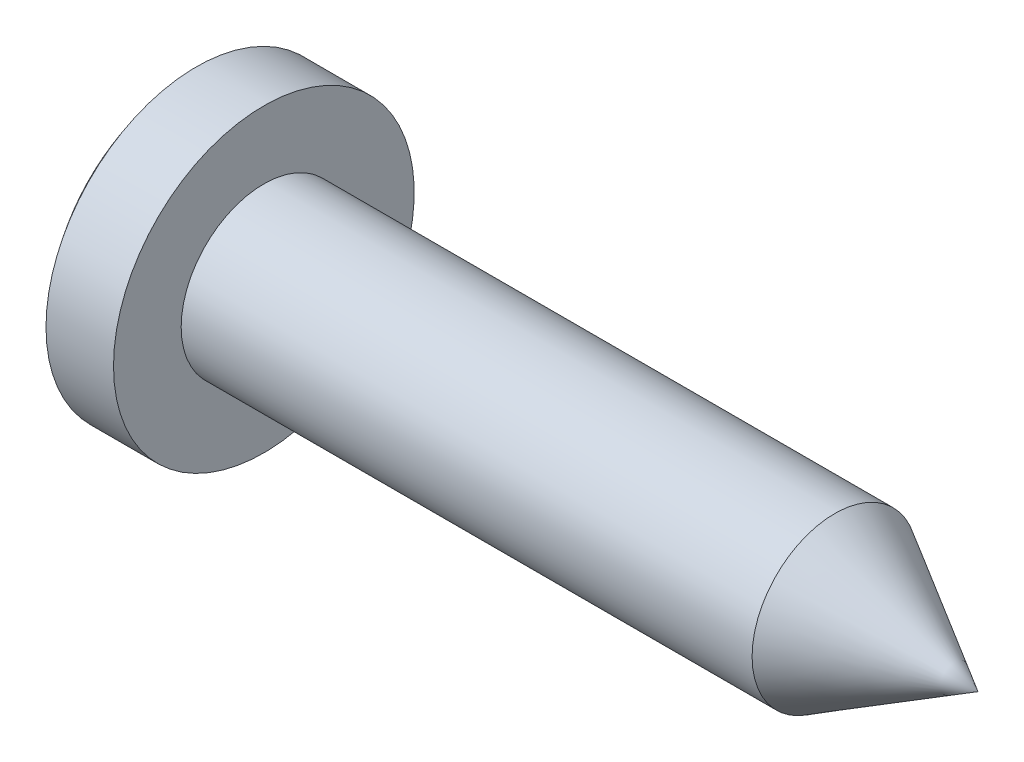
ISO-10303-21;
HEADER;
FILE_DESCRIPTION(('STEP AP214'),'2;1');
FILE_NAME('part.step','',(''),(''),'','','');
FILE_SCHEMA(('AUTOMOTIVE_DESIGN { 1 0 10303 214 1 1 1 1 }'));
ENDSEC;
DATA;
#1=APPLICATION_CONTEXT('core data for automotive mechanical design processes');
#2=APPLICATION_PROTOCOL_DEFINITION('international standard','automotive_design',2000,#1);
#3=PRODUCT_CONTEXT('',#1,'mechanical');
#4=PRODUCT('Part','Part','',(#3));
#5=PRODUCT_RELATED_PRODUCT_CATEGORY('part','',(#4));
#6=PRODUCT_DEFINITION_FORMATION('','',#4);
#7=PRODUCT_DEFINITION_CONTEXT('part definition',#1,'design');
#8=PRODUCT_DEFINITION('design','',#6,#7);
#9=PRODUCT_DEFINITION_SHAPE('','',#8);
#10=(LENGTH_UNIT() NAMED_UNIT(*) SI_UNIT(.MILLI.,.METRE.));
#11=(NAMED_UNIT(*) PLANE_ANGLE_UNIT() SI_UNIT($,.RADIAN.));
#12=(NAMED_UNIT(*) SI_UNIT($,.STERADIAN.) SOLID_ANGLE_UNIT());
#13=UNCERTAINTY_MEASURE_WITH_UNIT(LENGTH_MEASURE(1.E-05),#10,'distance_accuracy_value','');
#14=(GEOMETRIC_REPRESENTATION_CONTEXT(3) GLOBAL_UNCERTAINTY_ASSIGNED_CONTEXT((#13)) GLOBAL_UNIT_ASSIGNED_CONTEXT((#10,
#11,#12)) REPRESENTATION_CONTEXT('',''));
#15=CARTESIAN_POINT('',(0.,0.,0.));
#16=DIRECTION('',(0.,0.,1.));
#17=DIRECTION('',(1.,0.,0.));
#18=AXIS2_PLACEMENT_3D('',#15,#16,#17);
#19=CARTESIAN_POINT('',(1.6,0.,0.));
#20=DIRECTION('',(-1.,0.,0.));
#21=DIRECTION('',(0.,1.,0.));
#22=AXIS2_PLACEMENT_3D('',#19,#20,#21);
#23=SPHERICAL_SURFACE('',#22,3.2);
#24=CARTESIAN_POINT('',(-0.89799919935936,0.,0.));
#25=DIRECTION('',(-1.,0.,0.));
#26=DIRECTION('',(0.,0.,1.));
#27=AXIS2_PLACEMENT_3D('',#24,#25,#26);
#28=CIRCLE('',#27,2.);
#29=CARTESIAN_POINT('',(-0.89799919935936,0.,2.));
#30=VERTEX_POINT('',#29);
#31=EDGE_CURVE('E288',#30,#30,#28,.T.);
#32=ORIENTED_EDGE('',*,*,#31,.T.);
#33=EDGE_LOOP('',(#32));
#34=FACE_BOUND('',#33,.T.);
#35=CARTESIAN_POINT('',(1.56503616117409,0.0806815870157537,0.322726348063015));
#36=DIRECTION('',(0.104528463267654,-0.241206989505462,-0.964827958021851));
#37=DIRECTION('',(0.,0.970142500145332,-0.242535625036333));
#38=AXIS2_PLACEMENT_3D('',#35,#36,#37);
#39=CIRCLE('',#38,3.18247006517848);
#40=CARTESIAN_POINT('',(-1.45274996309991,0.934523397478773,-0.217677932639515));
#41=VERTEX_POINT('',#40);
#42=CARTESIAN_POINT('',(-1.54602165644221,0.569150220513997,-0.136439597205102));
#43=VERTEX_POINT('',#42);
#44=EDGE_CURVE('E11',#41,#43,#39,.F.);
#45=ORIENTED_EDGE('',*,*,#44,.F.);
#46=CARTESIAN_POINT('',(1.66379421431252,0.606961405040141,0.));
#47=DIRECTION('',(0.104528463267654,0.994521895368273,0.));
#48=DIRECTION('',(-0.994521895368273,0.104528463267654,0.));
#49=AXIS2_PLACEMENT_3D('',#46,#47,#48);
#50=CIRCLE('',#49,3.14126219074625);
#51=CARTESIAN_POINT('',(-1.45274996309991,0.934523397478773,0.217677932639514));
#52=VERTEX_POINT('',#51);
#53=EDGE_CURVE('E43',#52,#41,#50,.F.);
#54=ORIENTED_EDGE('',*,*,#53,.F.);
#55=CARTESIAN_POINT('',(1.56503616117409,0.0806815870157537,-0.322726348063015));
#56=DIRECTION('',(0.104528463267654,-0.241206989505462,0.964827958021851));
#57=DIRECTION('',(0.,-0.970142500145332,-0.242535625036333));
#58=AXIS2_PLACEMENT_3D('',#55,#56,#57);
#59=CIRCLE('',#58,3.18247006517848);
#60=CARTESIAN_POINT('',(-1.54602165644221,0.569150220513997,0.136439597205102));
#61=VERTEX_POINT('',#60);
#62=EDGE_CURVE('E328',#61,#52,#59,.F.);
#63=ORIENTED_EDGE('',*,*,#62,.F.);
#64=CARTESIAN_POINT('',(1.60749262454255,0.0356437803082173,0.0617368384676569));
#65=DIRECTION('',(0.104528463267654,0.497260947684128,0.861281226008779));
#66=DIRECTION('',(0.,-0.866025403784443,0.499999999999992));
#67=AXIS2_PLACEMENT_3D('',#64,#65,#66);
#68=CIRCLE('',#67,3.19919707806175);
#69=CARTESIAN_POINT('',(-1.57234339721419,0.296847915734236,0.296847915734238));
#70=VERTEX_POINT('',#69);
#71=EDGE_CURVE('E326',#70,#61,#68,.F.);
#72=ORIENTED_EDGE('',*,*,#71,.F.);
#73=CARTESIAN_POINT('',(1.60749262454255,0.0617368384676551,0.0356437803082149));
#74=DIRECTION('',(0.104528463267654,0.861281226008788,0.497260947684114));
#75=DIRECTION('',(0.,-0.499999999999977,0.866025403784452));
#76=AXIS2_PLACEMENT_3D('',#73,#74,#75);
#77=CIRCLE('',#76,3.19919707806175);
#78=CARTESIAN_POINT('',(-1.54602165644221,0.136439597205108,0.569150220513995));
#79=VERTEX_POINT('',#78);
#80=EDGE_CURVE('E324',#79,#70,#77,.F.);
#81=ORIENTED_EDGE('',*,*,#80,.F.);
#82=CARTESIAN_POINT('',(1.56503616117409,-0.322726348063014,0.0806815870157571));
#83=DIRECTION('',(0.104528463267654,0.964827958021848,-0.241206989505473));
#84=DIRECTION('',(0.,0.242535625036343,0.970142500145329));
#85=AXIS2_PLACEMENT_3D('',#82,#83,#84);
#86=CIRCLE('',#85,3.18247006517848);
#87=CARTESIAN_POINT('',(-1.45274996309991,0.217677932639524,0.934523397478771));
#88=VERTEX_POINT('',#87);
#89=EDGE_CURVE('E322',#88,#79,#86,.F.);
#90=ORIENTED_EDGE('',*,*,#89,.F.);
#91=CARTESIAN_POINT('',(1.66379421431252,0.,0.606961405040141));
#92=DIRECTION('',(0.104528463267654,0.,0.994521895368273));
#93=DIRECTION('',(0.994521895368273,0.,-0.104528463267654));
#94=AXIS2_PLACEMENT_3D('',#91,#92,#93);
#95=CIRCLE('',#94,3.14126219074625);
#96=CARTESIAN_POINT('',(-1.45274996309991,-0.217677932639505,0.934523397478775));
#97=VERTEX_POINT('',#96);
#98=EDGE_CURVE('E320',#97,#88,#95,.F.);
#99=ORIENTED_EDGE('',*,*,#98,.F.);
#100=CARTESIAN_POINT('',(1.56503616117409,0.322726348063016,0.0806815870157503));
#101=DIRECTION('',(0.104528463267654,-0.964827958021853,-0.241206989505452));
#102=DIRECTION('',(0.,0.242535625036323,-0.970142500145334));
#103=AXIS2_PLACEMENT_3D('',#100,#101,#102);
#104=CIRCLE('',#103,3.18247006517848);
#105=CARTESIAN_POINT('',(-1.54602165644221,-0.136439597205096,0.569150220513998));
#106=VERTEX_POINT('',#105);
#107=EDGE_CURVE('E318',#106,#97,#104,.F.);
#108=ORIENTED_EDGE('',*,*,#107,.F.);
#109=CARTESIAN_POINT('',(1.60749262454255,-0.0617368384676559,0.0356437803082175));
#110=DIRECTION('',(0.104528463267654,-0.861281226008775,0.497260947684136));
#111=DIRECTION('',(0.,-0.499999999999999,-0.866025403784439));
#112=AXIS2_PLACEMENT_3D('',#109,#110,#111);
#113=CIRCLE('',#112,3.19919707806175);
#114=CARTESIAN_POINT('',(-1.57234339721419,-0.296847915734233,0.296847915734241));
#115=VERTEX_POINT('',#114);
#116=EDGE_CURVE('E316',#115,#106,#113,.F.);
#117=ORIENTED_EDGE('',*,*,#116,.F.);
#118=CARTESIAN_POINT('',(1.60749262454255,-0.035643780308217,0.0617368384676573));
#119=DIRECTION('',(0.104528463267654,-0.497260947684123,0.861281226008782));
#120=DIRECTION('',(0.,-0.866025403784447,-0.499999999999986));
#121=AXIS2_PLACEMENT_3D('',#118,#119,#120);
#122=CIRCLE('',#121,3.19919707806175);
#123=CARTESIAN_POINT('',(-1.54602165644221,-0.569150220513996,0.136439597205106));
#124=VERTEX_POINT('',#123);
#125=EDGE_CURVE('E314',#124,#115,#122,.F.);
#126=ORIENTED_EDGE('',*,*,#125,.F.);
#127=CARTESIAN_POINT('',(1.56503616117409,-0.0806815870157559,-0.322726348063015));
#128=DIRECTION('',(0.104528463267654,0.241206989505469,0.964827958021849));
#129=DIRECTION('',(0.,-0.97014250014533,0.242535625036339));
#130=AXIS2_PLACEMENT_3D('',#127,#128,#129);
#131=CIRCLE('',#130,3.18247006517848);
#132=CARTESIAN_POINT('',(-1.45274996309991,-0.934523397478772,0.217677932639521));
#133=VERTEX_POINT('',#132);
#134=EDGE_CURVE('E312',#133,#124,#131,.F.);
#135=ORIENTED_EDGE('',*,*,#134,.F.);
#136=CARTESIAN_POINT('',(1.66379421431252,-0.606961405040141,0.));
#137=DIRECTION('',(0.104528463267654,-0.994521895368273,0.));
#138=DIRECTION('',(0.994521895368273,0.104528463267654,0.));
#139=AXIS2_PLACEMENT_3D('',#136,#137,#138);
#140=CIRCLE('',#139,3.14126219074625);
#141=CARTESIAN_POINT('',(-1.45274996309991,-0.934523397478775,-0.217677932639508));
#142=VERTEX_POINT('',#141);
#143=EDGE_CURVE('E310',#142,#133,#140,.F.);
#144=ORIENTED_EDGE('',*,*,#143,.F.);
#145=CARTESIAN_POINT('',(1.56503616117409,-0.0806815870157514,0.322726348063016));
#146=DIRECTION('',(0.104528463267654,0.241206989505456,-0.964827958021853));
#147=DIRECTION('',(0.,0.970142500145334,0.242535625036326));
#148=AXIS2_PLACEMENT_3D('',#145,#146,#147);
#149=CIRCLE('',#148,3.18247006517848);
#150=CARTESIAN_POINT('',(-1.54602165644221,-0.569150220513998,-0.136439597205098));
#151=VERTEX_POINT('',#150);
#152=EDGE_CURVE('E308',#151,#142,#149,.F.);
#153=ORIENTED_EDGE('',*,*,#152,.F.);
#154=CARTESIAN_POINT('',(1.60749262454255,-0.035643780308221,-0.0617368384676605));
#155=DIRECTION('',(0.104528463267654,-0.497260947684145,-0.861281226008769));
#156=DIRECTION('',(0.,0.866025403784434,-0.500000000000008));
#157=AXIS2_PLACEMENT_3D('',#154,#155,#156);
#158=CIRCLE('',#157,3.19919707806175);
#159=CARTESIAN_POINT('',(-1.57234339721419,-0.296847915734241,-0.296847915734238));
#160=VERTEX_POINT('',#159);
#161=EDGE_CURVE('E306',#160,#151,#158,.F.);
#162=ORIENTED_EDGE('',*,*,#161,.F.);
#163=CARTESIAN_POINT('',(1.60749262454255,-0.0617368384676609,-0.0356437803082204));
#164=DIRECTION('',(0.104528463267654,-0.861281226008775,-0.497260947684136));
#165=DIRECTION('',(0.,0.499999999999999,-0.866025403784439));
#166=AXIS2_PLACEMENT_3D('',#163,#164,#165);
#167=CIRCLE('',#166,3.19919707806175);
#168=CARTESIAN_POINT('',(-1.54602165644221,-0.136439597205104,-0.569150220513996));
#169=VERTEX_POINT('',#168);
#170=EDGE_CURVE('E304',#169,#160,#167,.F.);
#171=ORIENTED_EDGE('',*,*,#170,.F.);
#172=CARTESIAN_POINT('',(1.56503616117409,0.322726348063015,-0.0806815870157548));
#173=DIRECTION('',(0.104528463267654,-0.96482795802185,0.241206989505466));
#174=DIRECTION('',(0.,-0.242535625036336,-0.970142500145331));
#175=AXIS2_PLACEMENT_3D('',#172,#173,#174);
#176=CIRCLE('',#175,3.18247006517848);
#177=CARTESIAN_POINT('',(-1.45274996309991,-0.217677932639518,-0.934523397478772));
#178=VERTEX_POINT('',#177);
#179=EDGE_CURVE('E302',#178,#169,#176,.F.);
#180=ORIENTED_EDGE('',*,*,#179,.F.);
#181=CARTESIAN_POINT('',(1.66379421431252,0.,-0.606961405040141));
#182=DIRECTION('',(0.104528463267654,0.,-0.994521895368273));
#183=DIRECTION('',(-0.994521895368273,0.,-0.104528463267654));
#184=AXIS2_PLACEMENT_3D('',#181,#182,#183);
#185=CIRCLE('',#184,3.14126219074625);
#186=CARTESIAN_POINT('',(-1.45274996309991,0.217677932639511,-0.934523397478774));
#187=VERTEX_POINT('',#186);
#188=EDGE_CURVE('E300',#187,#178,#185,.F.);
#189=ORIENTED_EDGE('',*,*,#188,.F.);
#190=CARTESIAN_POINT('',(1.56503616117409,-0.322726348063015,-0.0806815870157525));
#191=DIRECTION('',(0.104528463267654,0.964827958021852,0.241206989505459));
#192=DIRECTION('',(0.,-0.242535625036329,0.970142500145333));
#193=AXIS2_PLACEMENT_3D('',#190,#191,#192);
#194=CIRCLE('',#193,3.18247006517848);
#195=CARTESIAN_POINT('',(-1.54602165644221,0.1364395972051,-0.569150220513997));
#196=VERTEX_POINT('',#195);
#197=EDGE_CURVE('E298',#196,#187,#194,.F.);
#198=ORIENTED_EDGE('',*,*,#197,.F.);
#199=CARTESIAN_POINT('',(1.60749262454255,0.0617368384676561,-0.035643780308217));
#200=DIRECTION('',(0.104528463267654,0.861281226008778,-0.497260947684129));
#201=DIRECTION('',(0.,0.499999999999993,0.866025403784443));
#202=AXIS2_PLACEMENT_3D('',#199,#200,#201);
#203=CIRCLE('',#202,3.19919707806175);
#204=CARTESIAN_POINT('',(-1.57234339721419,0.296847915734236,-0.296847915734239));
#205=VERTEX_POINT('',#204);
#206=EDGE_CURVE('E296',#205,#196,#203,.F.);
#207=ORIENTED_EDGE('',*,*,#206,.F.);
#208=CARTESIAN_POINT('',(1.60749262454255,0.0356437803082174,-0.061736838467657));
#209=DIRECTION('',(0.104528463267654,0.497260947684129,-0.861281226008779));
#210=DIRECTION('',(0.,0.866025403784443,0.499999999999992));
#211=AXIS2_PLACEMENT_3D('',#208,#209,#210);
#212=CIRCLE('',#211,3.19919707806175);
#213=EDGE_CURVE('E294',#43,#205,#212,.F.);
#214=ORIENTED_EDGE('',*,*,#213,.F.);
#215=EDGE_LOOP('',(#45,#54,#63,#72,#81,#90,#99,#108,#117,#126,#135,#144,#153,#162,#171,#180,
#189,#198,#207,#214));
#216=FACE_BOUND('',#215,.T.);
#217=ADVANCED_FACE('F35',(#34,#216),#23,.T.);
#218=CARTESIAN_POINT('',(0.,0.,0.));
#219=DIRECTION('',(-1.,0.,0.));
#220=DIRECTION('',(0.,0.,1.));
#221=AXIS2_PLACEMENT_3D('',#218,#219,#220);
#222=CYLINDRICAL_SURFACE('',#221,1.1);
#223=CARTESIAN_POINT('',(0.,0.,0.));
#224=DIRECTION('',(-1.,0.,0.));
#225=DIRECTION('',(0.,0.,1.));
#226=AXIS2_PLACEMENT_3D('',#223,#224,#225);
#227=CIRCLE('',#226,1.1);
#228=CARTESIAN_POINT('',(0.,0.,1.1));
#229=VERTEX_POINT('',#228);
#230=EDGE_CURVE('E195',#229,#229,#227,.T.);
#231=ORIENTED_EDGE('',*,*,#230,.F.);
#232=EDGE_LOOP('',(#231));
#233=FACE_BOUND('',#232,.T.);
#234=CARTESIAN_POINT('',(7.59474411167421,0.,0.));
#235=DIRECTION('',(-1.,0.,0.));
#236=DIRECTION('',(0.,0.,1.));
#237=AXIS2_PLACEMENT_3D('',#234,#235,#236);
#238=CIRCLE('',#237,1.1);
#239=CARTESIAN_POINT('',(7.59474411167421,0.,1.1));
#240=VERTEX_POINT('',#239);
#241=EDGE_CURVE('E191',#240,#240,#238,.T.);
#242=ORIENTED_EDGE('',*,*,#241,.T.);
#243=EDGE_LOOP('',(#242));
#244=FACE_BOUND('',#243,.T.);
#245=ADVANCED_FACE('F424',(#233,#244),#222,.T.);
#246=CARTESIAN_POINT('',(0.,1.1,0.));
#247=DIRECTION('',(-1.,0.,0.));
#248=DIRECTION('',(0.,0.,1.));
#249=AXIS2_PLACEMENT_3D('',#246,#247,#248);
#250=PLANE('',#249);
#251=CARTESIAN_POINT('',(0.,0.,0.));
#252=DIRECTION('',(-1.,0.,0.));
#253=DIRECTION('',(0.,0.,1.));
#254=AXIS2_PLACEMENT_3D('',#251,#252,#253);
#255=CIRCLE('',#254,2.);
#256=CARTESIAN_POINT('',(0.,0.,2.));
#257=VERTEX_POINT('',#256);
#258=EDGE_CURVE('E291',#257,#257,#255,.T.);
#259=ORIENTED_EDGE('',*,*,#258,.F.);
#260=EDGE_LOOP('',(#259));
#261=FACE_BOUND('',#260,.T.);
#262=ORIENTED_EDGE('',*,*,#230,.T.);
#263=EDGE_LOOP('',(#262));
#264=FACE_BOUND('',#263,.T.);
#265=ADVANCED_FACE('F37',(#261,#264),#250,.F.);
#266=CARTESIAN_POINT('',(0.,0.,0.));
#267=DIRECTION('',(-1.,0.,0.));
#268=DIRECTION('',(0.,0.,1.));
#269=AXIS2_PLACEMENT_3D('',#266,#267,#268);
#270=CYLINDRICAL_SURFACE('',#269,2.);
#271=ORIENTED_EDGE('',*,*,#31,.F.);
#272=EDGE_LOOP('',(#271));
#273=FACE_BOUND('',#272,.T.);
#274=ORIENTED_EDGE('',*,*,#258,.T.);
#275=EDGE_LOOP('',(#274));
#276=FACE_BOUND('',#275,.T.);
#277=ADVANCED_FACE('F433',(#273,#276),#270,.T.);
#278=CARTESIAN_POINT('',(7.59474411167421,0.,0.));
#279=DIRECTION('',(-1.,0.,0.));
#280=DIRECTION('',(0.,0.,1.));
#281=AXIS2_PLACEMENT_3D('',#278,#279,#280);
#282=CONICAL_SURFACE('',#281,1.1,0.523598775598293);
#283=CARTESIAN_POINT('',(9.5,0.,0.));
#284=VERTEX_POINT('',#283);
#285=VERTEX_LOOP('',#284);
#286=FACE_BOUND('',#285,.T.);
#287=ORIENTED_EDGE('',*,*,#241,.F.);
#288=EDGE_LOOP('',(#287));
#289=FACE_BOUND('',#288,.T.);
#290=ADVANCED_FACE('F435',(#286,#289),#282,.T.);
#291=CARTESIAN_POINT('',(-1.6,0.95,-0.2375));
#292=DIRECTION('',(0.104528463267654,-0.241206989505462,-0.964827958021851));
#293=DIRECTION('',(0.,0.970142500145332,-0.242535625036333));
#294=AXIS2_PLACEMENT_3D('',#291,#292,#293);
#295=PLANE('',#294);
#296=ORIENTED_EDGE('',*,*,#44,.T.);
#297=DIRECTION('',(-0.993634572314887,0.0156427600493606,-0.111560032084303));
#298=VECTOR('',#297,1.);
#299=CARTESIAN_POINT('',(-1.6,0.57,-0.1425));
#300=LINE('',#299,#298);
#301=CARTESIAN_POINT('',(-0.75,0.556618474827239,-0.0470664976705276));
#302=VERTEX_POINT('',#301);
#303=EDGE_CURVE('E50',#302,#43,#300,.T.);
#304=ORIENTED_EDGE('',*,*,#303,.F.);
#305=DIRECTION('',(0.,-0.970142500145332,0.242535625036333));
#306=VECTOR('',#305,1.);
#307=CARTESIAN_POINT('',(-0.75,0.0216677931850071,0.0866711727400304));
#308=LINE('',#307,#306);
#309=CARTESIAN_POINT('',(-0.75,0.860661400024174,-0.123077228969761));
#310=VERTEX_POINT('',#309);
#311=EDGE_CURVE('E175',#302,#310,#308,.F.);
#312=ORIENTED_EDGE('',*,*,#311,.T.);
#313=DIRECTION('',(-0.985727427293419,0.103604127426078,-0.132693722013437));
#314=VECTOR('',#313,1.);
#315=CARTESIAN_POINT('',(-1.53787007542131,0.943469881790042,-0.229136378665655));
#316=LINE('',#315,#314);
#317=EDGE_CURVE('E186',#310,#41,#316,.T.);
#318=ORIENTED_EDGE('',*,*,#317,.T.);
#319=EDGE_LOOP('',(#296,#304,#312,#318));
#320=FACE_BOUND('',#319,.T.);
#321=ADVANCED_FACE('F185',(#320),#295,.F.);
#322=CARTESIAN_POINT('',(-1.6,0.95,0.2375));
#323=DIRECTION('',(0.104528463267654,0.994521895368273,0.));
#324=DIRECTION('',(-0.994521895368273,0.104528463267654,0.));
#325=AXIS2_PLACEMENT_3D('',#322,#323,#324);
#326=PLANE('',#325);
#327=ORIENTED_EDGE('',*,*,#53,.T.);
#328=ORIENTED_EDGE('',*,*,#317,.F.);
#329=DIRECTION('',(0.,0.,-1.));
#330=VECTOR('',#329,1.);
#331=CARTESIAN_POINT('',(-0.75,0.860661400024175,0.));
#332=LINE('',#331,#330);
#333=CARTESIAN_POINT('',(-0.75,0.860661400024174,0.123077228969761));
#334=VERTEX_POINT('',#333);
#335=EDGE_CURVE('E171',#310,#334,#332,.F.);
#336=ORIENTED_EDGE('',*,*,#335,.T.);
#337=DIRECTION('',(-0.985727427293419,0.103604127426078,0.132693722013437));
#338=VECTOR('',#337,1.);
#339=CARTESIAN_POINT('',(-1.6,0.95,0.2375));
#340=LINE('',#339,#338);
#341=EDGE_CURVE('E192',#334,#52,#340,.T.);
#342=ORIENTED_EDGE('',*,*,#341,.T.);
#343=EDGE_LOOP('',(#327,#328,#336,#342));
#344=FACE_BOUND('',#343,.T.);
#345=ADVANCED_FACE('F189',(#344),#326,.F.);
#346=CARTESIAN_POINT('',(-1.6,0.95,0.2375));
#347=DIRECTION('',(0.104528463267654,-0.241206989505462,0.964827958021851));
#348=DIRECTION('',(0.,-0.970142500145332,-0.242535625036333));
#349=AXIS2_PLACEMENT_3D('',#346,#347,#348);
#350=PLANE('',#349);
#351=ORIENTED_EDGE('',*,*,#62,.T.);
#352=ORIENTED_EDGE('',*,*,#341,.F.);
#353=DIRECTION('',(0.,0.970142500145332,0.242535625036333));
#354=VECTOR('',#353,1.);
#355=CARTESIAN_POINT('',(-0.75,0.0216677931850069,-0.0866711727400304));
#356=LINE('',#355,#354);
#357=CARTESIAN_POINT('',(-0.75,0.556618474827239,0.0470664976705276));
#358=VERTEX_POINT('',#357);
#359=EDGE_CURVE('E177',#334,#358,#356,.F.);
#360=ORIENTED_EDGE('',*,*,#359,.T.);
#361=DIRECTION('',(-0.993634572314886,0.0156427600493606,0.111560032084303));
#362=VECTOR('',#361,1.);
#363=CARTESIAN_POINT('',(-1.61643715208567,0.57025876960518,0.14434547646101));
#364=LINE('',#363,#362);
#365=EDGE_CURVE('E197',#358,#61,#364,.T.);
#366=ORIENTED_EDGE('',*,*,#365,.T.);
#367=EDGE_LOOP('',(#351,#352,#360,#366));
#368=FACE_BOUND('',#367,.T.);
#369=ADVANCED_FACE('F331',(#368),#350,.F.);
#370=CARTESIAN_POINT('',(-1.6,0.57,0.1425));
#371=DIRECTION('',(0.104528463267654,0.497260947684128,0.861281226008779));
#372=DIRECTION('',(0.,-0.866025403784443,0.499999999999992));
#373=AXIS2_PLACEMENT_3D('',#370,#371,#372);
#374=PLANE('',#373);
#375=ORIENTED_EDGE('',*,*,#71,.T.);
#376=ORIENTED_EDGE('',*,*,#365,.F.);
#377=DIRECTION('',(0.,0.866025403784443,-0.499999999999992));
#378=VECTOR('',#377,1.);
#379=CARTESIAN_POINT('',(-0.75,0.159535010031724,0.276322742960963));
#380=LINE('',#379,#378);
#381=CARTESIAN_POINT('',(-0.75,0.233575465858467,0.233575465858471));
#382=VERTEX_POINT('',#381);
#383=EDGE_CURVE('E253',#358,#382,#380,.F.);
#384=ORIENTED_EDGE('',*,*,#383,.T.);
#385=DIRECTION('',(-0.994132040497618,0.0764901498757915,0.0764901498757902));
#386=VECTOR('',#385,1.);
#387=CARTESIAN_POINT('',(-1.60871040111109,0.299646052667046,0.299646052667049));
#388=LINE('',#387,#386);
#389=EDGE_CURVE('E247',#382,#70,#388,.T.);
#390=ORIENTED_EDGE('',*,*,#389,.T.);
#391=EDGE_LOOP('',(#375,#376,#384,#390));
#392=FACE_BOUND('',#391,.T.);
#393=ADVANCED_FACE('F414',(#392),#374,.F.);
#394=CARTESIAN_POINT('',(-1.6,0.142500000000006,0.569999999999998));
#395=DIRECTION('',(0.104528463267654,0.861281226008788,0.497260947684114));
#396=DIRECTION('',(0.,-0.499999999999977,0.866025403784452));
#397=AXIS2_PLACEMENT_3D('',#394,#395,#396);
#398=PLANE('',#397);
#399=ORIENTED_EDGE('',*,*,#80,.T.);
#400=ORIENTED_EDGE('',*,*,#389,.F.);
#401=DIRECTION('',(0.,0.499999999999977,-0.866025403784452));
#402=VECTOR('',#401,1.);
#403=CARTESIAN_POINT('',(-0.75,0.276322742960963,0.159535010031718));
#404=LINE('',#403,#402);
#405=CARTESIAN_POINT('',(-0.75,0.0470664976705335,0.556618474827239));
#406=VERTEX_POINT('',#405);
#407=EDGE_CURVE('E255',#382,#406,#404,.F.);
#408=ORIENTED_EDGE('',*,*,#407,.T.);
#409=DIRECTION('',(-0.993634572314886,0.111560032084303,0.0156427600493589));
#410=VECTOR('',#409,1.);
#411=CARTESIAN_POINT('',(-1.6,0.142500000000006,0.569999999999998));
#412=LINE('',#411,#410);
#413=EDGE_CURVE('E244',#406,#79,#412,.T.);
#414=ORIENTED_EDGE('',*,*,#413,.T.);
#415=EDGE_LOOP('',(#399,#400,#408,#414));
#416=FACE_BOUND('',#415,.T.);
#417=ADVANCED_FACE('F411',(#416),#398,.F.);
#418=CARTESIAN_POINT('',(-1.6,0.23750000000001,0.949999999999997));
#419=DIRECTION('',(0.104528463267654,0.964827958021848,-0.241206989505473));
#420=DIRECTION('',(0.,0.242535625036343,0.970142500145329));
#421=AXIS2_PLACEMENT_3D('',#418,#419,#420);
#422=PLANE('',#421);
#423=ORIENTED_EDGE('',*,*,#89,.T.);
#424=ORIENTED_EDGE('',*,*,#413,.F.);
#425=DIRECTION('',(0.,-0.242535625036343,-0.970142500145329));
#426=VECTOR('',#425,1.);
#427=CARTESIAN_POINT('',(-0.75,-0.0866711727400301,0.0216677931850079));
#428=LINE('',#427,#426);
#429=CARTESIAN_POINT('',(-0.75,0.12307722896977,0.860661400024173));
#430=VERTEX_POINT('',#429);
#431=EDGE_CURVE('E257',#406,#430,#428,.F.);
#432=ORIENTED_EDGE('',*,*,#431,.T.);
#433=DIRECTION('',(-0.985727427293419,0.132693722013438,0.103604127426076));
#434=VECTOR('',#433,1.);
#435=CARTESIAN_POINT('',(-1.53787007542131,0.229136378665665,0.94346988179004));
#436=LINE('',#435,#434);
#437=EDGE_CURVE('E241',#430,#88,#436,.T.);
#438=ORIENTED_EDGE('',*,*,#437,.T.);
#439=EDGE_LOOP('',(#423,#424,#432,#438));
#440=FACE_BOUND('',#439,.T.);
#441=ADVANCED_FACE('F408',(#440),#422,.F.);
#442=CARTESIAN_POINT('',(-1.6,-0.23749999999999,0.950000000000002));
#443=DIRECTION('',(0.104528463267654,0.,0.994521895368273));
#444=DIRECTION('',(0.994521895368273,0.,-0.104528463267654));
#445=AXIS2_PLACEMENT_3D('',#442,#443,#444);
#446=PLANE('',#445);
#447=ORIENTED_EDGE('',*,*,#98,.T.);
#448=ORIENTED_EDGE('',*,*,#437,.F.);
#449=DIRECTION('',(0.,1.,0.));
#450=VECTOR('',#449,1.);
#451=CARTESIAN_POINT('',(-0.75,0.,0.860661400024174));
#452=LINE('',#451,#450);
#453=CARTESIAN_POINT('',(-0.75,-0.123077228969752,0.860661400024176));
#454=VERTEX_POINT('',#453);
#455=EDGE_CURVE('E259',#430,#454,#452,.F.);
#456=ORIENTED_EDGE('',*,*,#455,.T.);
#457=DIRECTION('',(-0.985727427293419,-0.132693722013436,0.103604127426079));
#458=VECTOR('',#457,1.);
#459=CARTESIAN_POINT('',(-1.6,-0.23749999999999,0.950000000000002));
#460=LINE('',#459,#458);
#461=EDGE_CURVE('E238',#454,#97,#460,.T.);
#462=ORIENTED_EDGE('',*,*,#461,.T.);
#463=EDGE_LOOP('',(#447,#448,#456,#462));
#464=FACE_BOUND('',#463,.T.);
#465=ADVANCED_FACE('F401',(#464),#446,.F.);
#466=CARTESIAN_POINT('',(-1.6,-0.23749999999999,0.950000000000002));
#467=DIRECTION('',(0.104528463267654,-0.964827958021853,-0.241206989505452));
#468=DIRECTION('',(0.,0.242535625036323,-0.970142500145334));
#469=AXIS2_PLACEMENT_3D('',#466,#467,#468);
#470=PLANE('',#469);
#471=ORIENTED_EDGE('',*,*,#107,.T.);
#472=ORIENTED_EDGE('',*,*,#461,.F.);
#473=DIRECTION('',(0.,-0.242535625036323,0.970142500145334));
#474=VECTOR('',#473,1.);
#475=CARTESIAN_POINT('',(-0.75,0.0866711727400305,0.0216677931850063));
#476=LINE('',#475,#474);
#477=CARTESIAN_POINT('',(-0.75,-0.0470664976705218,0.55661847482724));
#478=VERTEX_POINT('',#477);
#479=EDGE_CURVE('E261',#454,#478,#476,.F.);
#480=ORIENTED_EDGE('',*,*,#479,.T.);
#481=DIRECTION('',(-0.993634572314887,-0.111560032084303,0.0156427600493616));
#482=VECTOR('',#481,1.);
#483=CARTESIAN_POINT('',(-1.61643715208567,-0.144345476461004,0.570258769605181));
#484=LINE('',#483,#482);
#485=EDGE_CURVE('E235',#478,#106,#484,.T.);
#486=ORIENTED_EDGE('',*,*,#485,.T.);
#487=EDGE_LOOP('',(#471,#472,#480,#486));
#488=FACE_BOUND('',#487,.T.);
#489=ADVANCED_FACE('F399',(#488),#470,.F.);
#490=CARTESIAN_POINT('',(-1.6,-0.142499999999994,0.570000000000001));
#491=DIRECTION('',(0.104528463267654,-0.861281226008775,0.497260947684136));
#492=DIRECTION('',(0.,-0.499999999999999,-0.866025403784439));
#493=AXIS2_PLACEMENT_3D('',#490,#491,#492);
#494=PLANE('',#493);
#495=ORIENTED_EDGE('',*,*,#116,.T.);
#496=ORIENTED_EDGE('',*,*,#485,.F.);
#497=DIRECTION('',(0.,0.499999999999999,0.866025403784439));
#498=VECTOR('',#497,1.);
#499=CARTESIAN_POINT('',(-0.75,-0.276322742960961,0.159535010031725));
#500=LINE('',#499,#498);
#501=CARTESIAN_POINT('',(-0.75,-0.233575465858466,0.233575465858472));
#502=VERTEX_POINT('',#501);
#503=EDGE_CURVE('E263',#478,#502,#500,.F.);
#504=ORIENTED_EDGE('',*,*,#503,.T.);
#505=DIRECTION('',(-0.994132040497618,-0.07649014987579,0.0764901498757912));
#506=VECTOR('',#505,1.);
#507=CARTESIAN_POINT('',(-1.60871040111109,-0.299646052667044,0.299646052667052));
#508=LINE('',#507,#506);
#509=EDGE_CURVE('E232',#502,#115,#508,.T.);
#510=ORIENTED_EDGE('',*,*,#509,.T.);
#511=EDGE_LOOP('',(#495,#496,#504,#510));
#512=FACE_BOUND('',#511,.T.);
#513=ADVANCED_FACE('F392',(#512),#494,.F.);
#514=CARTESIAN_POINT('',(-1.6,-0.569999999999999,0.142500000000004));
#515=DIRECTION('',(0.104528463267654,-0.497260947684123,0.861281226008782));
#516=DIRECTION('',(0.,-0.866025403784447,-0.499999999999986));
#517=AXIS2_PLACEMENT_3D('',#514,#515,#516);
#518=PLANE('',#517);
#519=ORIENTED_EDGE('',*,*,#125,.T.);
#520=ORIENTED_EDGE('',*,*,#509,.F.);
#521=DIRECTION('',(0.,0.866025403784447,0.499999999999986));
#522=VECTOR('',#521,1.);
#523=CARTESIAN_POINT('',(-0.75,-0.159535010031723,0.276322742960963));
#524=LINE('',#523,#522);
#525=CARTESIAN_POINT('',(-0.75,-0.556618474827239,0.0470664976705315));
#526=VERTEX_POINT('',#525);
#527=EDGE_CURVE('E265',#502,#526,#524,.F.);
#528=ORIENTED_EDGE('',*,*,#527,.T.);
#529=DIRECTION('',(-0.993634572314887,-0.0156427600493598,0.111560032084303));
#530=VECTOR('',#529,1.);
#531=CARTESIAN_POINT('',(-1.6,-0.569999999999999,0.142500000000004));
#532=LINE('',#531,#530);
#533=EDGE_CURVE('E229',#526,#124,#532,.T.);
#534=ORIENTED_EDGE('',*,*,#533,.T.);
#535=EDGE_LOOP('',(#519,#520,#528,#534));
#536=FACE_BOUND('',#535,.T.);
#537=ADVANCED_FACE('F389',(#536),#518,.F.);
#538=CARTESIAN_POINT('',(-1.6,-0.949999999999998,0.237500000000007));
#539=DIRECTION('',(0.104528463267654,0.241206989505469,0.964827958021849));
#540=DIRECTION('',(0.,-0.97014250014533,0.242535625036339));
#541=AXIS2_PLACEMENT_3D('',#538,#539,#540);
#542=PLANE('',#541);
#543=ORIENTED_EDGE('',*,*,#134,.T.);
#544=ORIENTED_EDGE('',*,*,#533,.F.);
#545=DIRECTION('',(0.,0.97014250014533,-0.242535625036339));
#546=VECTOR('',#545,1.);
#547=CARTESIAN_POINT('',(-0.75,-0.0216677931850086,-0.0866711727400299));
#548=LINE('',#547,#546);
#549=CARTESIAN_POINT('',(-0.75,-0.860661400024174,0.123077228969767));
#550=VERTEX_POINT('',#549);
#551=EDGE_CURVE('E267',#526,#550,#548,.F.);
#552=ORIENTED_EDGE('',*,*,#551,.T.);
#553=DIRECTION('',(-0.985727427293419,-0.103604127426077,0.132693722013438));
#554=VECTOR('',#553,1.);
#555=CARTESIAN_POINT('',(-1.53787007542131,-0.943469881790041,0.229136378665662));
#556=LINE('',#555,#554);
#557=EDGE_CURVE('E226',#550,#133,#556,.T.);
#558=ORIENTED_EDGE('',*,*,#557,.T.);
#559=EDGE_LOOP('',(#543,#544,#552,#558));
#560=FACE_BOUND('',#559,.T.);
#561=ADVANCED_FACE('F381',(#560),#542,.F.);
#562=CARTESIAN_POINT('',(-1.6,-0.950000000000001,-0.237499999999994));
#563=DIRECTION('',(0.104528463267654,-0.994521895368273,0.));
#564=DIRECTION('',(0.994521895368273,0.104528463267654,0.));
#565=AXIS2_PLACEMENT_3D('',#562,#563,#564);
#566=PLANE('',#565);
#567=ORIENTED_EDGE('',*,*,#143,.T.);
#568=ORIENTED_EDGE('',*,*,#557,.F.);
#569=DIRECTION('',(0.,0.,1.));
#570=VECTOR('',#569,1.);
#571=CARTESIAN_POINT('',(-0.75,-0.860661400024175,0.));
#572=LINE('',#571,#570);
#573=CARTESIAN_POINT('',(-0.75,-0.860661400024175,-0.123077228969755));
#574=VERTEX_POINT('',#573);
#575=EDGE_CURVE('E269',#550,#574,#572,.F.);
#576=ORIENTED_EDGE('',*,*,#575,.T.);
#577=DIRECTION('',(-0.985727427293419,-0.103604127426079,-0.132693722013436));
#578=VECTOR('',#577,1.);
#579=CARTESIAN_POINT('',(-1.6,-0.950000000000001,-0.237499999999994));
#580=LINE('',#579,#578);
#581=EDGE_CURVE('E223',#574,#142,#580,.T.);
#582=ORIENTED_EDGE('',*,*,#581,.T.);
#583=EDGE_LOOP('',(#567,#568,#576,#582));
#584=FACE_BOUND('',#583,.T.);
#585=ADVANCED_FACE('F379',(#584),#566,.F.);
#586=CARTESIAN_POINT('',(-1.6,-0.950000000000001,-0.237499999999994));
#587=DIRECTION('',(0.104528463267654,0.241206989505456,-0.964827958021853));
#588=DIRECTION('',(0.,0.970142500145334,0.242535625036326));
#589=AXIS2_PLACEMENT_3D('',#586,#587,#588);
#590=PLANE('',#589);
#591=ORIENTED_EDGE('',*,*,#152,.T.);
#592=ORIENTED_EDGE('',*,*,#581,.F.);
#593=DIRECTION('',(0.,-0.970142500145334,-0.242535625036326));
#594=VECTOR('',#593,1.);
#595=CARTESIAN_POINT('',(-0.75,-0.0216677931850076,0.0866711727400303));
#596=LINE('',#595,#594);
#597=CARTESIAN_POINT('',(-0.75,-0.556618474827239,-0.0470664976705236));
#598=VERTEX_POINT('',#597);
#599=EDGE_CURVE('E271',#574,#598,#596,.F.);
#600=ORIENTED_EDGE('',*,*,#599,.T.);
#601=DIRECTION('',(-0.993634572314886,-0.015642760049362,-0.111560032084303));
#602=VECTOR('',#601,1.);
#603=CARTESIAN_POINT('',(-1.61643715208567,-0.570258769605181,-0.144345476461006));
#604=LINE('',#603,#602);
#605=EDGE_CURVE('E220',#598,#151,#604,.T.);
#606=ORIENTED_EDGE('',*,*,#605,.T.);
#607=EDGE_LOOP('',(#591,#592,#600,#606));
#608=FACE_BOUND('',#607,.T.);
#609=ADVANCED_FACE('F372',(#608),#590,.F.);
#610=CARTESIAN_POINT('',(-1.6,-0.570000000000001,-0.142499999999996));
#611=DIRECTION('',(0.104528463267654,-0.497260947684145,-0.861281226008769));
#612=DIRECTION('',(0.,0.866025403784434,-0.500000000000008));
#613=AXIS2_PLACEMENT_3D('',#610,#611,#612);
#614=PLANE('',#613);
#615=ORIENTED_EDGE('',*,*,#161,.T.);
#616=ORIENTED_EDGE('',*,*,#605,.F.);
#617=DIRECTION('',(0.,-0.866025403784434,0.500000000000008));
#618=VECTOR('',#617,1.);
#619=CARTESIAN_POINT('',(-0.75,-0.159535010031732,-0.276322742960964));
#620=LINE('',#619,#618);
#621=CARTESIAN_POINT('',(-0.75,-0.233575465858473,-0.233575465858471));
#622=VERTEX_POINT('',#621);
#623=EDGE_CURVE('E273',#598,#622,#620,.F.);
#624=ORIENTED_EDGE('',*,*,#623,.T.);
#625=DIRECTION('',(-0.994132040497618,-0.0764901498757908,-0.07649014987579));
#626=VECTOR('',#625,1.);
#627=CARTESIAN_POINT('',(-1.60871040111109,-0.299646052667052,-0.299646052667049));
#628=LINE('',#627,#626);
#629=EDGE_CURVE('E217',#622,#160,#628,.T.);
#630=ORIENTED_EDGE('',*,*,#629,.T.);
#631=EDGE_LOOP('',(#615,#616,#624,#630));
#632=FACE_BOUND('',#631,.T.);
#633=ADVANCED_FACE('F369',(#632),#614,.F.);
#634=CARTESIAN_POINT('',(-1.6,-0.142500000000002,-0.569999999999999));
#635=DIRECTION('',(0.104528463267654,-0.861281226008775,-0.497260947684136));
#636=DIRECTION('',(0.,0.499999999999999,-0.866025403784439));
#637=AXIS2_PLACEMENT_3D('',#634,#635,#636);
#638=PLANE('',#637);
#639=ORIENTED_EDGE('',*,*,#170,.T.);
#640=ORIENTED_EDGE('',*,*,#629,.F.);
#641=DIRECTION('',(0.,-0.499999999999999,0.866025403784439));
#642=VECTOR('',#641,1.);
#643=CARTESIAN_POINT('',(-0.75,-0.276322742960966,-0.159535010031729));
#644=LINE('',#643,#642);
#645=CARTESIAN_POINT('',(-0.75,-0.0470664976705294,-0.556618474827239));
#646=VERTEX_POINT('',#645);
#647=EDGE_CURVE('E275',#622,#646,#644,.F.);
#648=ORIENTED_EDGE('',*,*,#647,.T.);
#649=DIRECTION('',(-0.993634572314886,-0.111560032084303,-0.0156427600493608));
#650=VECTOR('',#649,1.);
#651=CARTESIAN_POINT('',(-1.6,-0.142500000000002,-0.569999999999999));
#652=LINE('',#651,#650);
#653=EDGE_CURVE('E214',#646,#169,#652,.T.);
#654=ORIENTED_EDGE('',*,*,#653,.T.);
#655=EDGE_LOOP('',(#639,#640,#648,#654));
#656=FACE_BOUND('',#655,.T.);
#657=ADVANCED_FACE('F361',(#656),#638,.F.);
#658=CARTESIAN_POINT('',(-1.6,-0.237500000000003,-0.949999999999999));
#659=DIRECTION('',(0.104528463267654,-0.96482795802185,0.241206989505466));
#660=DIRECTION('',(0.,-0.242535625036336,-0.970142500145331));
#661=AXIS2_PLACEMENT_3D('',#658,#659,#660);
#662=PLANE('',#661);
#663=ORIENTED_EDGE('',*,*,#179,.T.);
#664=ORIENTED_EDGE('',*,*,#653,.F.);
#665=DIRECTION('',(0.,0.242535625036336,0.970142500145331));
#666=VECTOR('',#665,1.);
#667=CARTESIAN_POINT('',(-0.75,0.08667117274003,-0.0216677931850084));
#668=LINE('',#667,#666);
#669=CARTESIAN_POINT('',(-0.75,-0.123077228969764,-0.860661400024174));
#670=VERTEX_POINT('',#669);
#671=EDGE_CURVE('E277',#646,#670,#668,.F.);
#672=ORIENTED_EDGE('',*,*,#671,.T.);
#673=DIRECTION('',(-0.985727427293419,-0.132693722013437,-0.103604127426077));
#674=VECTOR('',#673,1.);
#675=CARTESIAN_POINT('',(-1.53787007542131,-0.229136378665658,-0.943469881790042));
#676=LINE('',#675,#674);
#677=EDGE_CURVE('E211',#670,#178,#676,.T.);
#678=ORIENTED_EDGE('',*,*,#677,.T.);
#679=EDGE_LOOP('',(#663,#664,#672,#678));
#680=FACE_BOUND('',#679,.T.);
#681=ADVANCED_FACE('F359',(#680),#662,.F.);
#682=CARTESIAN_POINT('',(-1.6,0.237499999999997,-0.950000000000001));
#683=DIRECTION('',(0.104528463267654,0.,-0.994521895368273));
#684=DIRECTION('',(-0.994521895368273,0.,-0.104528463267654));
#685=AXIS2_PLACEMENT_3D('',#682,#683,#684);
#686=PLANE('',#685);
#687=ORIENTED_EDGE('',*,*,#188,.T.);
#688=ORIENTED_EDGE('',*,*,#677,.F.);
#689=DIRECTION('',(0.,-1.,0.));
#690=VECTOR('',#689,1.);
#691=CARTESIAN_POINT('',(-0.75,0.,-0.860661400024174));
#692=LINE('',#691,#690);
#693=CARTESIAN_POINT('',(-0.75,0.123077228969758,-0.860661400024175));
#694=VERTEX_POINT('',#693);
#695=EDGE_CURVE('E279',#670,#694,#692,.F.);
#696=ORIENTED_EDGE('',*,*,#695,.T.);
#697=DIRECTION('',(-0.985727427293418,0.132693722013436,-0.103604127426078));
#698=VECTOR('',#697,1.);
#699=CARTESIAN_POINT('',(-1.6,0.237499999999997,-0.950000000000001));
#700=LINE('',#699,#698);
#701=EDGE_CURVE('E208',#694,#187,#700,.T.);
#702=ORIENTED_EDGE('',*,*,#701,.T.);
#703=EDGE_LOOP('',(#687,#688,#696,#702));
#704=FACE_BOUND('',#703,.T.);
#705=ADVANCED_FACE('F352',(#704),#686,.F.);
#706=CARTESIAN_POINT('',(-1.6,0.237499999999997,-0.950000000000001));
#707=DIRECTION('',(0.104528463267654,0.964827958021852,0.241206989505459));
#708=DIRECTION('',(0.,-0.242535625036329,0.970142500145333));
#709=AXIS2_PLACEMENT_3D('',#706,#707,#708);
#710=PLANE('',#709);
#711=ORIENTED_EDGE('',*,*,#197,.T.);
#712=ORIENTED_EDGE('',*,*,#701,.F.);
#713=DIRECTION('',(0.,0.242535625036329,-0.970142500145333));
#714=VECTOR('',#713,1.);
#715=CARTESIAN_POINT('',(-0.75,-0.0866711727400303,-0.0216677931850075));
#716=LINE('',#715,#714);
#717=CARTESIAN_POINT('',(-0.75,0.0470664976705257,-0.55661847482724));
#718=VERTEX_POINT('',#717);
#719=EDGE_CURVE('E281',#694,#718,#716,.F.);
#720=ORIENTED_EDGE('',*,*,#719,.T.);
#721=DIRECTION('',(-0.993634572314887,0.111560032084303,-0.0156427600493608));
#722=VECTOR('',#721,1.);
#723=CARTESIAN_POINT('',(-1.61643715208567,0.144345476461008,-0.57025876960518));
#724=LINE('',#723,#722);
#725=EDGE_CURVE('E205',#718,#196,#724,.T.);
#726=ORIENTED_EDGE('',*,*,#725,.T.);
#727=EDGE_LOOP('',(#711,#712,#720,#726));
#728=FACE_BOUND('',#727,.T.);
#729=ADVANCED_FACE('F349',(#728),#710,.F.);
#730=CARTESIAN_POINT('',(-1.6,0.142499999999998,-0.57));
#731=DIRECTION('',(0.104528463267654,0.861281226008778,-0.497260947684129));
#732=DIRECTION('',(0.,0.499999999999993,0.866025403784443));
#733=AXIS2_PLACEMENT_3D('',#730,#731,#732);
#734=PLANE('',#733);
#735=ORIENTED_EDGE('',*,*,#206,.T.);
#736=ORIENTED_EDGE('',*,*,#725,.F.);
#737=DIRECTION('',(0.,-0.499999999999993,-0.866025403784443));
#738=VECTOR('',#737,1.);
#739=CARTESIAN_POINT('',(-0.75,0.276322742960961,-0.159535010031725));
#740=LINE('',#739,#738);
#741=CARTESIAN_POINT('',(-0.75,0.233575465858468,-0.233575465858471));
#742=VERTEX_POINT('',#741);
#743=EDGE_CURVE('E283',#718,#742,#740,.F.);
#744=ORIENTED_EDGE('',*,*,#743,.T.);
#745=DIRECTION('',(-0.994132040497618,0.0764901498757906,-0.0764901498757907));
#746=VECTOR('',#745,1.);
#747=CARTESIAN_POINT('',(-1.60871040111109,0.299646052667046,-0.299646052667049));
#748=LINE('',#747,#746);
#749=EDGE_CURVE('E201',#742,#205,#748,.T.);
#750=ORIENTED_EDGE('',*,*,#749,.T.);
#751=EDGE_LOOP('',(#735,#736,#744,#750));
#752=FACE_BOUND('',#751,.T.);
#753=ADVANCED_FACE('F341',(#752),#734,.F.);
#754=CARTESIAN_POINT('',(-1.6,0.57,-0.1425));
#755=DIRECTION('',(0.104528463267654,0.497260947684129,-0.861281226008779));
#756=DIRECTION('',(0.,0.866025403784443,0.499999999999992));
#757=AXIS2_PLACEMENT_3D('',#754,#755,#756);
#758=PLANE('',#757);
#759=ORIENTED_EDGE('',*,*,#213,.T.);
#760=ORIENTED_EDGE('',*,*,#749,.F.);
#761=DIRECTION('',(0.,-0.866025403784443,-0.499999999999992));
#762=VECTOR('',#761,1.);
#763=CARTESIAN_POINT('',(-0.75,0.159535010031724,-0.276322742960963));
#764=LINE('',#763,#762);
#765=EDGE_CURVE('E202',#742,#302,#764,.F.);
#766=ORIENTED_EDGE('',*,*,#765,.T.);
#767=ORIENTED_EDGE('',*,*,#303,.T.);
#768=EDGE_LOOP('',(#759,#760,#766,#767));
#769=FACE_BOUND('',#768,.T.);
#770=ADVANCED_FACE('F339',(#769),#758,.F.);
#771=CARTESIAN_POINT('',(-0.75,0.,0.));
#772=DIRECTION('',(-1.,0.,0.));
#773=DIRECTION('',(0.,0.,1.));
#774=AXIS2_PLACEMENT_3D('',#771,#772,#773);
#775=PLANE('',#774);
#776=ORIENTED_EDGE('',*,*,#311,.F.);
#777=ORIENTED_EDGE('',*,*,#765,.F.);
#778=ORIENTED_EDGE('',*,*,#743,.F.);
#779=ORIENTED_EDGE('',*,*,#719,.F.);
#780=ORIENTED_EDGE('',*,*,#695,.F.);
#781=ORIENTED_EDGE('',*,*,#671,.F.);
#782=ORIENTED_EDGE('',*,*,#647,.F.);
#783=ORIENTED_EDGE('',*,*,#623,.F.);
#784=ORIENTED_EDGE('',*,*,#599,.F.);
#785=ORIENTED_EDGE('',*,*,#575,.F.);
#786=ORIENTED_EDGE('',*,*,#551,.F.);
#787=ORIENTED_EDGE('',*,*,#527,.F.);
#788=ORIENTED_EDGE('',*,*,#503,.F.);
#789=ORIENTED_EDGE('',*,*,#479,.F.);
#790=ORIENTED_EDGE('',*,*,#455,.F.);
#791=ORIENTED_EDGE('',*,*,#431,.F.);
#792=ORIENTED_EDGE('',*,*,#407,.F.);
#793=ORIENTED_EDGE('',*,*,#383,.F.);
#794=ORIENTED_EDGE('',*,*,#359,.F.);
#795=ORIENTED_EDGE('',*,*,#335,.F.);
#796=EDGE_LOOP('',(#776,#777,#778,#779,#780,#781,#782,#783,#784,#785,#786,#787,#788,#789,#790,
#791,#792,#793,#794,#795));
#797=FACE_BOUND('',#796,.T.);
#798=ADVANCED_FACE('F173',(#797),#775,.T.);
#799=CLOSED_SHELL('',(#217,#245,#265,#277,#290,#321,#345,#369,#393,#417,#441,#465,#489,#513,
#537,#561,#585,#609,#633,#657,#681,#705,#729,#753,#770,#798));
#800=MANIFOLD_SOLID_BREP('B2',#799);
#801=ADVANCED_BREP_SHAPE_REPRESENTATION('',(#18,#800),#14);
#802=SHAPE_DEFINITION_REPRESENTATION(#9,#801);
ENDSEC;
END-ISO-10303-21;
